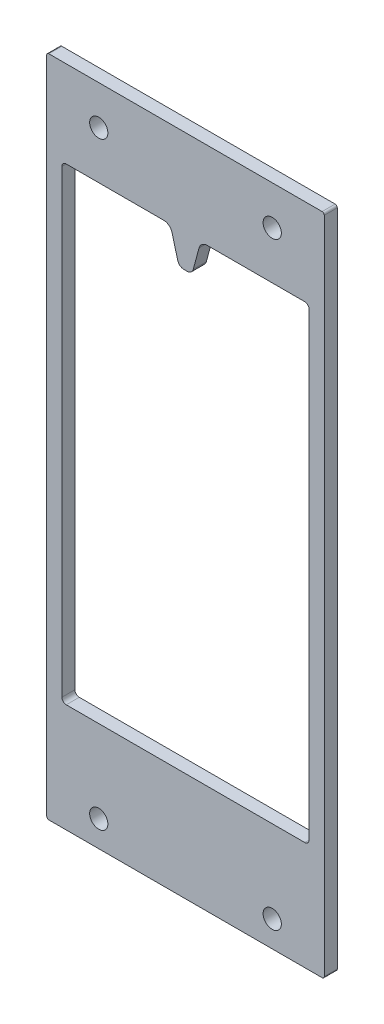
ISO-10303-21;
HEADER;
FILE_DESCRIPTION(('STEP AP214'),'2;1');
FILE_NAME('part.step','',(''),(''),'','','');
FILE_SCHEMA(('AUTOMOTIVE_DESIGN { 1 0 10303 214 1 1 1 1 }'));
ENDSEC;
DATA;
#1=APPLICATION_CONTEXT('core data for automotive mechanical design processes');
#2=APPLICATION_PROTOCOL_DEFINITION('international standard','automotive_design',2000,#1);
#3=PRODUCT_CONTEXT('',#1,'mechanical');
#4=PRODUCT('Part','Part','',(#3));
#5=PRODUCT_RELATED_PRODUCT_CATEGORY('part','',(#4));
#6=PRODUCT_DEFINITION_FORMATION('','',#4);
#7=PRODUCT_DEFINITION_CONTEXT('part definition',#1,'design');
#8=PRODUCT_DEFINITION('design','',#6,#7);
#9=PRODUCT_DEFINITION_SHAPE('','',#8);
#10=(LENGTH_UNIT() NAMED_UNIT(*) SI_UNIT(.MILLI.,.METRE.));
#11=(NAMED_UNIT(*) PLANE_ANGLE_UNIT() SI_UNIT($,.RADIAN.));
#12=(NAMED_UNIT(*) SI_UNIT($,.STERADIAN.) SOLID_ANGLE_UNIT());
#13=UNCERTAINTY_MEASURE_WITH_UNIT(LENGTH_MEASURE(1.E-05),#10,'distance_accuracy_value','');
#14=(GEOMETRIC_REPRESENTATION_CONTEXT(3) GLOBAL_UNCERTAINTY_ASSIGNED_CONTEXT((#13)) GLOBAL_UNIT_ASSIGNED_CONTEXT((#10,
#11,#12)) REPRESENTATION_CONTEXT('',''));
#15=CARTESIAN_POINT('',(0.,0.,0.));
#16=DIRECTION('',(0.,0.,1.));
#17=DIRECTION('',(1.,0.,0.));
#18=AXIS2_PLACEMENT_3D('',#15,#16,#17);
#19=CARTESIAN_POINT('',(0.,0.,3.));
#20=DIRECTION('',(0.,0.,1.));
#21=DIRECTION('',(1.,0.,0.));
#22=AXIS2_PLACEMENT_3D('',#19,#20,#21);
#23=PLANE('',#22);
#24=CARTESIAN_POINT('',(48.5,-127.,3.));
#25=DIRECTION('',(0.,0.,1.));
#26=DIRECTION('',(1.,0.,0.));
#27=AXIS2_PLACEMENT_3D('',#24,#25,#26);
#28=CIRCLE('',#27,2.09999999999999);
#29=CARTESIAN_POINT('',(50.6,-127.,3.));
#30=VERTEX_POINT('',#29);
#31=EDGE_CURVE('E516',#30,#30,#28,.T.);
#32=ORIENTED_EDGE('',*,*,#31,.F.);
#33=EDGE_LOOP('',(#32));
#34=FACE_BOUND('',#33,.T.);
#35=CARTESIAN_POINT('',(8.49999999999999,11.,3.));
#36=DIRECTION('',(0.,0.,1.));
#37=DIRECTION('',(1.,0.,0.));
#38=AXIS2_PLACEMENT_3D('',#35,#36,#37);
#39=CIRCLE('',#38,2.1);
#40=CARTESIAN_POINT('',(10.6,11.,3.));
#41=VERTEX_POINT('',#40);
#42=EDGE_CURVE('E260',#41,#41,#39,.T.);
#43=ORIENTED_EDGE('',*,*,#42,.F.);
#44=EDGE_LOOP('',(#43));
#45=FACE_BOUND('',#44,.T.);
#46=DIRECTION('',(1.,0.,0.));
#47=VECTOR('',#46,1.);
#48=CARTESIAN_POINT('',(-3.49999999999999,-133.,3.));
#49=LINE('',#48,#47);
#50=CARTESIAN_POINT('',(-2.99999999999999,-133.,3.));
#51=VERTEX_POINT('',#50);
#52=CARTESIAN_POINT('',(60.,-133.,3.));
#53=VERTEX_POINT('',#52);
#54=EDGE_CURVE('E325',#51,#53,#49,.T.);
#55=ORIENTED_EDGE('',*,*,#54,.T.);
#56=CARTESIAN_POINT('',(60.,-132.5,3.));
#57=DIRECTION('',(0.,0.,1.));
#58=DIRECTION('',(1.,0.,0.));
#59=AXIS2_PLACEMENT_3D('',#56,#57,#58);
#60=CIRCLE('',#59,0.5);
#61=CARTESIAN_POINT('',(60.5,-132.5,3.));
#62=VERTEX_POINT('',#61);
#63=EDGE_CURVE('E387',#53,#62,#60,.T.);
#64=ORIENTED_EDGE('',*,*,#63,.T.);
#65=DIRECTION('',(0.,1.,0.));
#66=VECTOR('',#65,1.);
#67=CARTESIAN_POINT('',(60.5,20.,3.));
#68=LINE('',#67,#66);
#69=CARTESIAN_POINT('',(60.5,19.5,3.));
#70=VERTEX_POINT('',#69);
#71=EDGE_CURVE('E330',#62,#70,#68,.T.);
#72=ORIENTED_EDGE('',*,*,#71,.T.);
#73=CARTESIAN_POINT('',(60.,19.5,3.));
#74=DIRECTION('',(0.,0.,1.));
#75=DIRECTION('',(1.,0.,0.));
#76=AXIS2_PLACEMENT_3D('',#73,#74,#75);
#77=CIRCLE('',#76,0.5);
#78=CARTESIAN_POINT('',(60.,20.,3.));
#79=VERTEX_POINT('',#78);
#80=EDGE_CURVE('E381',#70,#79,#77,.T.);
#81=ORIENTED_EDGE('',*,*,#80,.T.);
#82=DIRECTION('',(-1.,0.,0.));
#83=VECTOR('',#82,1.);
#84=CARTESIAN_POINT('',(-3.50000000000001,20.,3.));
#85=LINE('',#84,#83);
#86=CARTESIAN_POINT('',(-3.00000000000001,20.,3.));
#87=VERTEX_POINT('',#86);
#88=EDGE_CURVE('E334',#79,#87,#85,.T.);
#89=ORIENTED_EDGE('',*,*,#88,.T.);
#90=CARTESIAN_POINT('',(-3.00000000000001,19.5,3.));
#91=DIRECTION('',(0.,0.,1.));
#92=DIRECTION('',(1.,0.,0.));
#93=AXIS2_PLACEMENT_3D('',#90,#91,#92);
#94=CIRCLE('',#93,0.5);
#95=CARTESIAN_POINT('',(-3.50000000000001,19.5,3.));
#96=VERTEX_POINT('',#95);
#97=EDGE_CURVE('E378',#87,#96,#94,.T.);
#98=ORIENTED_EDGE('',*,*,#97,.T.);
#99=DIRECTION('',(0.,-1.,0.));
#100=VECTOR('',#99,1.);
#101=CARTESIAN_POINT('',(-3.50000000000001,20.,3.));
#102=LINE('',#101,#100);
#103=CARTESIAN_POINT('',(-3.49999999999999,-132.5,3.));
#104=VERTEX_POINT('',#103);
#105=EDGE_CURVE('E321',#96,#104,#102,.T.);
#106=ORIENTED_EDGE('',*,*,#105,.T.);
#107=CARTESIAN_POINT('',(-2.99999999999999,-132.5,3.));
#108=DIRECTION('',(0.,0.,1.));
#109=DIRECTION('',(1.,0.,0.));
#110=AXIS2_PLACEMENT_3D('',#107,#108,#109);
#111=CIRCLE('',#110,0.5);
#112=EDGE_CURVE('E384',#104,#51,#111,.T.);
#113=ORIENTED_EDGE('',*,*,#112,.T.);
#114=EDGE_LOOP('',(#55,#64,#72,#81,#89,#98,#106,#113));
#115=FACE_BOUND('',#114,.T.);
#116=DIRECTION('',(1.,0.,0.));
#117=VECTOR('',#116,1.);
#118=CARTESIAN_POINT('',(0.,-108.,3.));
#119=LINE('',#118,#117);
#120=CARTESIAN_POINT('',(1.00000000000001,-108.,3.));
#121=VERTEX_POINT('',#120);
#122=CARTESIAN_POINT('',(56.,-108.,3.));
#123=VERTEX_POINT('',#122);
#124=EDGE_CURVE('E497',#121,#123,#119,.T.);
#125=ORIENTED_EDGE('',*,*,#124,.F.);
#126=CARTESIAN_POINT('',(1.00000000000001,-107.,3.));
#127=DIRECTION('',(0.,0.,1.));
#128=DIRECTION('',(1.,0.,0.));
#129=AXIS2_PLACEMENT_3D('',#126,#127,#128);
#130=CIRCLE('',#129,1.);
#131=CARTESIAN_POINT('',(0.,-107.,3.));
#132=VERTEX_POINT('',#131);
#133=EDGE_CURVE('E439',#121,#132,#130,.F.);
#134=ORIENTED_EDGE('',*,*,#133,.T.);
#135=DIRECTION('',(0.,-1.,0.));
#136=VECTOR('',#135,1.);
#137=CARTESIAN_POINT('',(0.,0.,3.));
#138=LINE('',#137,#136);
#139=CARTESIAN_POINT('',(0.,-1.,3.));
#140=VERTEX_POINT('',#139);
#141=EDGE_CURVE('E301',#140,#132,#138,.T.);
#142=ORIENTED_EDGE('',*,*,#141,.F.);
#143=CARTESIAN_POINT('',(1.,-1.,3.));
#144=DIRECTION('',(0.,0.,1.));
#145=DIRECTION('',(1.,0.,0.));
#146=AXIS2_PLACEMENT_3D('',#143,#144,#145);
#147=CIRCLE('',#146,1.);
#148=CARTESIAN_POINT('',(1.,0.,3.));
#149=VERTEX_POINT('',#148);
#150=EDGE_CURVE('E11',#140,#149,#147,.F.);
#151=ORIENTED_EDGE('',*,*,#150,.T.);
#152=DIRECTION('',(-1.,0.,0.));
#153=VECTOR('',#152,1.);
#154=CARTESIAN_POINT('',(0.,0.,3.));
#155=LINE('',#154,#153);
#156=CARTESIAN_POINT('',(23.4557270808087,0.,3.));
#157=VERTEX_POINT('',#156);
#158=EDGE_CURVE('E251',#157,#149,#155,.T.);
#159=ORIENTED_EDGE('',*,*,#158,.F.);
#160=CARTESIAN_POINT('',(23.4557270808087,-2.,3.));
#161=DIRECTION('',(0.,0.,1.));
#162=DIRECTION('',(1.,0.,0.));
#163=AXIS2_PLACEMENT_3D('',#160,#161,#162);
#164=CIRCLE('',#163,2.);
#165=CARTESIAN_POINT('',(25.3875787333868,-1.48236190979496,3.));
#166=VERTEX_POINT('',#165);
#167=EDGE_CURVE('E247',#166,#157,#164,.T.);
#168=ORIENTED_EDGE('',*,*,#167,.F.);
#169=DIRECTION('',(-0.258819045102519,0.965925826289069,0.));
#170=VECTOR('',#169,1.);
#171=CARTESIAN_POINT('',(25.3875787333868,-1.48236190979496,3.));
#172=LINE('',#171,#170);
#173=CARTESIAN_POINT('',(26.7021017425348,-6.38822856765378,3.));
#174=VERTEX_POINT('',#173);
#175=EDGE_CURVE('E244',#174,#166,#172,.T.);
#176=ORIENTED_EDGE('',*,*,#175,.F.);
#177=CARTESIAN_POINT('',(28.1509904819684,-6.,3.));
#178=DIRECTION('',(0.,0.,-1.));
#179=DIRECTION('',(-1.,0.,0.));
#180=AXIS2_PLACEMENT_3D('',#177,#178,#179);
#181=CIRCLE('',#180,1.5);
#182=CARTESIAN_POINT('',(28.1509904819684,-7.5,3.));
#183=VERTEX_POINT('',#182);
#184=EDGE_CURVE('E241',#183,#174,#181,.T.);
#185=ORIENTED_EDGE('',*,*,#184,.F.);
#186=DIRECTION('',(-1.,0.,0.));
#187=VECTOR('',#186,1.);
#188=CARTESIAN_POINT('',(28.1509904819684,-7.5,3.));
#189=LINE('',#188,#187);
#190=CARTESIAN_POINT('',(28.8490095180316,-7.5,3.));
#191=VERTEX_POINT('',#190);
#192=EDGE_CURVE('E238',#191,#183,#189,.T.);
#193=ORIENTED_EDGE('',*,*,#192,.F.);
#194=CARTESIAN_POINT('',(28.8490095180316,-6.,3.));
#195=DIRECTION('',(0.,0.,-1.));
#196=DIRECTION('',(1.,0.,0.));
#197=AXIS2_PLACEMENT_3D('',#194,#195,#196);
#198=CIRCLE('',#197,1.5);
#199=CARTESIAN_POINT('',(30.2978982574652,-6.38822856765378,3.));
#200=VERTEX_POINT('',#199);
#201=EDGE_CURVE('E232',#200,#191,#198,.T.);
#202=ORIENTED_EDGE('',*,*,#201,.F.);
#203=DIRECTION('',(-0.258819045102517,-0.965925826289069,0.));
#204=VECTOR('',#203,1.);
#205=CARTESIAN_POINT('',(30.2978982574652,-6.38822856765378,3.));
#206=LINE('',#205,#204);
#207=CARTESIAN_POINT('',(31.6124212666132,-1.48236190979497,3.));
#208=VERTEX_POINT('',#207);
#209=EDGE_CURVE('E228',#208,#200,#206,.T.);
#210=ORIENTED_EDGE('',*,*,#209,.F.);
#211=CARTESIAN_POINT('',(33.5442729191913,-2.,3.));
#212=DIRECTION('',(0.,0.,1.));
#213=DIRECTION('',(1.,0.,0.));
#214=AXIS2_PLACEMENT_3D('',#211,#212,#213);
#215=CIRCLE('',#214,2.);
#216=CARTESIAN_POINT('',(33.5442729191913,0.,3.));
#217=VERTEX_POINT('',#216);
#218=EDGE_CURVE('E212',#217,#208,#215,.T.);
#219=ORIENTED_EDGE('',*,*,#218,.F.);
#220=DIRECTION('',(-1.,0.,0.));
#221=VECTOR('',#220,1.);
#222=CARTESIAN_POINT('',(33.5442729191913,0.,3.));
#223=LINE('',#222,#221);
#224=CARTESIAN_POINT('',(56.,0.,3.));
#225=VERTEX_POINT('',#224);
#226=EDGE_CURVE('E201',#225,#217,#223,.T.);
#227=ORIENTED_EDGE('',*,*,#226,.F.);
#228=CARTESIAN_POINT('',(56.,-1.,3.));
#229=DIRECTION('',(0.,0.,1.));
#230=DIRECTION('',(1.,0.,0.));
#231=AXIS2_PLACEMENT_3D('',#228,#229,#230);
#232=CIRCLE('',#231,1.);
#233=CARTESIAN_POINT('',(57.,-1.,3.));
#234=VERTEX_POINT('',#233);
#235=EDGE_CURVE('E445',#225,#234,#232,.F.);
#236=ORIENTED_EDGE('',*,*,#235,.T.);
#237=DIRECTION('',(0.,1.,0.));
#238=VECTOR('',#237,1.);
#239=CARTESIAN_POINT('',(57.,0.,3.));
#240=LINE('',#239,#238);
#241=CARTESIAN_POINT('',(57.,-107.,3.));
#242=VERTEX_POINT('',#241);
#243=EDGE_CURVE('E213',#242,#234,#240,.T.);
#244=ORIENTED_EDGE('',*,*,#243,.F.);
#245=CARTESIAN_POINT('',(56.,-107.,3.));
#246=DIRECTION('',(0.,0.,1.));
#247=DIRECTION('',(1.,0.,0.));
#248=AXIS2_PLACEMENT_3D('',#245,#246,#247);
#249=CIRCLE('',#248,1.);
#250=EDGE_CURVE('E433',#242,#123,#249,.F.);
#251=ORIENTED_EDGE('',*,*,#250,.T.);
#252=EDGE_LOOP('',(#125,#134,#142,#151,#159,#168,#176,#185,#193,#202,#210,#219,#227,#236,#244,#251));
#253=FACE_BOUND('',#252,.T.);
#254=CARTESIAN_POINT('',(48.5,11.,3.));
#255=DIRECTION('',(0.,0.,1.));
#256=DIRECTION('',(-1.,0.,0.));
#257=AXIS2_PLACEMENT_3D('',#254,#255,#256);
#258=CIRCLE('',#257,2.1);
#259=CARTESIAN_POINT('',(46.4,11.,3.));
#260=VERTEX_POINT('',#259);
#261=EDGE_CURVE('E508',#260,#260,#258,.T.);
#262=ORIENTED_EDGE('',*,*,#261,.F.);
#263=EDGE_LOOP('',(#262));
#264=FACE_BOUND('',#263,.T.);
#265=CARTESIAN_POINT('',(8.49999999999999,-127.,3.));
#266=DIRECTION('',(0.,0.,1.));
#267=DIRECTION('',(-1.,0.,0.));
#268=AXIS2_PLACEMENT_3D('',#265,#266,#267);
#269=CIRCLE('',#268,2.1);
#270=CARTESIAN_POINT('',(6.4,-127.,3.));
#271=VERTEX_POINT('',#270);
#272=EDGE_CURVE('E524',#271,#271,#269,.T.);
#273=ORIENTED_EDGE('',*,*,#272,.F.);
#274=EDGE_LOOP('',(#273));
#275=FACE_BOUND('',#274,.T.);
#276=ADVANCED_FACE('F39',(#34,#45,#115,#253,#264,#275),#23,.T.);
#277=CARTESIAN_POINT('',(0.,0.,0.));
#278=DIRECTION('',(0.,0.,1.));
#279=DIRECTION('',(1.,0.,0.));
#280=AXIS2_PLACEMENT_3D('',#277,#278,#279);
#281=PLANE('',#280);
#282=DIRECTION('',(0.,1.,0.));
#283=VECTOR('',#282,1.);
#284=CARTESIAN_POINT('',(60.5,20.,0.));
#285=LINE('',#284,#283);
#286=CARTESIAN_POINT('',(60.5,-132.5,0.));
#287=VERTEX_POINT('',#286);
#288=CARTESIAN_POINT('',(60.5,19.5,0.));
#289=VERTEX_POINT('',#288);
#290=EDGE_CURVE('E346',#287,#289,#285,.T.);
#291=ORIENTED_EDGE('',*,*,#290,.F.);
#292=CARTESIAN_POINT('',(60.,-132.5,0.));
#293=DIRECTION('',(0.,0.,1.));
#294=DIRECTION('',(1.,0.,0.));
#295=AXIS2_PLACEMENT_3D('',#292,#293,#294);
#296=CIRCLE('',#295,0.5);
#297=CARTESIAN_POINT('',(60.,-133.,0.));
#298=VERTEX_POINT('',#297);
#299=EDGE_CURVE('E368',#287,#298,#296,.F.);
#300=ORIENTED_EDGE('',*,*,#299,.T.);
#301=DIRECTION('',(1.,0.,0.));
#302=VECTOR('',#301,1.);
#303=CARTESIAN_POINT('',(-3.49999999999999,-133.,0.));
#304=LINE('',#303,#302);
#305=CARTESIAN_POINT('',(-2.99999999999999,-133.,0.));
#306=VERTEX_POINT('',#305);
#307=EDGE_CURVE('E342',#306,#298,#304,.T.);
#308=ORIENTED_EDGE('',*,*,#307,.F.);
#309=CARTESIAN_POINT('',(-2.99999999999999,-132.5,0.));
#310=DIRECTION('',(0.,0.,1.));
#311=DIRECTION('',(1.,0.,0.));
#312=AXIS2_PLACEMENT_3D('',#309,#310,#311);
#313=CIRCLE('',#312,0.5);
#314=CARTESIAN_POINT('',(-3.49999999999999,-132.5,0.));
#315=VERTEX_POINT('',#314);
#316=EDGE_CURVE('E365',#306,#315,#313,.F.);
#317=ORIENTED_EDGE('',*,*,#316,.T.);
#318=DIRECTION('',(0.,-1.,0.));
#319=VECTOR('',#318,1.);
#320=CARTESIAN_POINT('',(-3.50000000000001,20.,0.));
#321=LINE('',#320,#319);
#322=CARTESIAN_POINT('',(-3.50000000000001,19.5,0.));
#323=VERTEX_POINT('',#322);
#324=EDGE_CURVE('E221',#323,#315,#321,.T.);
#325=ORIENTED_EDGE('',*,*,#324,.F.);
#326=CARTESIAN_POINT('',(-3.00000000000001,19.5,0.));
#327=DIRECTION('',(0.,0.,1.));
#328=DIRECTION('',(1.,0.,0.));
#329=AXIS2_PLACEMENT_3D('',#326,#327,#328);
#330=CIRCLE('',#329,0.5);
#331=CARTESIAN_POINT('',(-3.00000000000001,20.,0.));
#332=VERTEX_POINT('',#331);
#333=EDGE_CURVE('E359',#323,#332,#330,.F.);
#334=ORIENTED_EDGE('',*,*,#333,.T.);
#335=DIRECTION('',(-1.,0.,0.));
#336=VECTOR('',#335,1.);
#337=CARTESIAN_POINT('',(-3.50000000000001,20.,0.));
#338=LINE('',#337,#336);
#339=CARTESIAN_POINT('',(60.,20.,0.));
#340=VERTEX_POINT('',#339);
#341=EDGE_CURVE('E326',#340,#332,#338,.T.);
#342=ORIENTED_EDGE('',*,*,#341,.F.);
#343=CARTESIAN_POINT('',(60.,19.5,0.));
#344=DIRECTION('',(0.,0.,1.));
#345=DIRECTION('',(1.,0.,0.));
#346=AXIS2_PLACEMENT_3D('',#343,#344,#345);
#347=CIRCLE('',#346,0.5);
#348=EDGE_CURVE('E362',#340,#289,#347,.F.);
#349=ORIENTED_EDGE('',*,*,#348,.T.);
#350=EDGE_LOOP('',(#291,#300,#308,#317,#325,#334,#342,#349));
#351=FACE_BOUND('',#350,.T.);
#352=DIRECTION('',(-1.,0.,0.));
#353=VECTOR('',#352,1.);
#354=CARTESIAN_POINT('',(0.,0.,0.));
#355=LINE('',#354,#353);
#356=CARTESIAN_POINT('',(23.4557270808087,0.,0.));
#357=VERTEX_POINT('',#356);
#358=CARTESIAN_POINT('',(1.,0.,0.));
#359=VERTEX_POINT('',#358);
#360=EDGE_CURVE('E297',#357,#359,#355,.T.);
#361=ORIENTED_EDGE('',*,*,#360,.T.);
#362=CARTESIAN_POINT('',(1.,-1.,0.));
#363=DIRECTION('',(0.,0.,1.));
#364=DIRECTION('',(1.,0.,0.));
#365=AXIS2_PLACEMENT_3D('',#362,#363,#364);
#366=CIRCLE('',#365,1.);
#367=CARTESIAN_POINT('',(0.,-1.,0.));
#368=VERTEX_POINT('',#367);
#369=EDGE_CURVE('E48',#359,#368,#366,.T.);
#370=ORIENTED_EDGE('',*,*,#369,.T.);
#371=DIRECTION('',(0.,-1.,0.));
#372=VECTOR('',#371,1.);
#373=CARTESIAN_POINT('',(0.,0.,0.));
#374=LINE('',#373,#372);
#375=CARTESIAN_POINT('',(0.,-107.,0.));
#376=VERTEX_POINT('',#375);
#377=EDGE_CURVE('E255',#368,#376,#374,.T.);
#378=ORIENTED_EDGE('',*,*,#377,.T.);
#379=CARTESIAN_POINT('',(1.00000000000001,-107.,0.));
#380=DIRECTION('',(0.,0.,1.));
#381=DIRECTION('',(1.,0.,0.));
#382=AXIS2_PLACEMENT_3D('',#379,#380,#381);
#383=CIRCLE('',#382,1.);
#384=CARTESIAN_POINT('',(1.00000000000001,-108.,0.));
#385=VERTEX_POINT('',#384);
#386=EDGE_CURVE('E436',#376,#385,#383,.T.);
#387=ORIENTED_EDGE('',*,*,#386,.T.);
#388=DIRECTION('',(1.,0.,0.));
#389=VECTOR('',#388,1.);
#390=CARTESIAN_POINT('',(0.,-108.,0.));
#391=LINE('',#390,#389);
#392=CARTESIAN_POINT('',(56.,-108.,0.));
#393=VERTEX_POINT('',#392);
#394=EDGE_CURVE('E259',#385,#393,#391,.T.);
#395=ORIENTED_EDGE('',*,*,#394,.T.);
#396=CARTESIAN_POINT('',(56.,-107.,0.));
#397=DIRECTION('',(0.,0.,1.));
#398=DIRECTION('',(1.,0.,0.));
#399=AXIS2_PLACEMENT_3D('',#396,#397,#398);
#400=CIRCLE('',#399,1.);
#401=CARTESIAN_POINT('',(57.,-107.,0.));
#402=VERTEX_POINT('',#401);
#403=EDGE_CURVE('E430',#393,#402,#400,.T.);
#404=ORIENTED_EDGE('',*,*,#403,.T.);
#405=DIRECTION('',(0.,1.,0.));
#406=VECTOR('',#405,1.);
#407=CARTESIAN_POINT('',(57.,0.,0.));
#408=LINE('',#407,#406);
#409=CARTESIAN_POINT('',(57.,-1.,0.));
#410=VERTEX_POINT('',#409);
#411=EDGE_CURVE('E264',#402,#410,#408,.T.);
#412=ORIENTED_EDGE('',*,*,#411,.T.);
#413=CARTESIAN_POINT('',(56.,-1.,0.));
#414=DIRECTION('',(0.,0.,1.));
#415=DIRECTION('',(1.,0.,0.));
#416=AXIS2_PLACEMENT_3D('',#413,#414,#415);
#417=CIRCLE('',#416,1.);
#418=CARTESIAN_POINT('',(56.,0.,0.));
#419=VERTEX_POINT('',#418);
#420=EDGE_CURVE('E442',#410,#419,#417,.T.);
#421=ORIENTED_EDGE('',*,*,#420,.T.);
#422=DIRECTION('',(-1.,0.,0.));
#423=VECTOR('',#422,1.);
#424=CARTESIAN_POINT('',(33.5442729191913,0.,0.));
#425=LINE('',#424,#423);
#426=CARTESIAN_POINT('',(33.5442729191913,0.,0.));
#427=VERTEX_POINT('',#426);
#428=EDGE_CURVE('E268',#419,#427,#425,.T.);
#429=ORIENTED_EDGE('',*,*,#428,.T.);
#430=CARTESIAN_POINT('',(33.5442729191913,-2.,0.));
#431=DIRECTION('',(0.,0.,1.));
#432=DIRECTION('',(1.,0.,0.));
#433=AXIS2_PLACEMENT_3D('',#430,#431,#432);
#434=CIRCLE('',#433,2.);
#435=CARTESIAN_POINT('',(31.6124212666132,-1.48236190979497,0.));
#436=VERTEX_POINT('',#435);
#437=EDGE_CURVE('E219',#427,#436,#434,.T.);
#438=ORIENTED_EDGE('',*,*,#437,.T.);
#439=DIRECTION('',(-0.258819045102517,-0.965925826289069,0.));
#440=VECTOR('',#439,1.);
#441=CARTESIAN_POINT('',(30.2978982574652,-6.38822856765378,0.));
#442=LINE('',#441,#440);
#443=CARTESIAN_POINT('',(30.2978982574652,-6.38822856765378,0.));
#444=VERTEX_POINT('',#443);
#445=EDGE_CURVE('E273',#436,#444,#442,.T.);
#446=ORIENTED_EDGE('',*,*,#445,.T.);
#447=CARTESIAN_POINT('',(28.8490095180316,-6.,0.));
#448=DIRECTION('',(0.,0.,-1.));
#449=DIRECTION('',(1.,0.,0.));
#450=AXIS2_PLACEMENT_3D('',#447,#448,#449);
#451=CIRCLE('',#450,1.5);
#452=CARTESIAN_POINT('',(28.8490095180316,-7.5,0.));
#453=VERTEX_POINT('',#452);
#454=EDGE_CURVE('E277',#444,#453,#451,.T.);
#455=ORIENTED_EDGE('',*,*,#454,.T.);
#456=DIRECTION('',(-1.,0.,0.));
#457=VECTOR('',#456,1.);
#458=CARTESIAN_POINT('',(28.1509904819684,-7.5,0.));
#459=LINE('',#458,#457);
#460=CARTESIAN_POINT('',(28.1509904819684,-7.5,0.));
#461=VERTEX_POINT('',#460);
#462=EDGE_CURVE('E281',#453,#461,#459,.T.);
#463=ORIENTED_EDGE('',*,*,#462,.T.);
#464=CARTESIAN_POINT('',(28.1509904819684,-6.,0.));
#465=DIRECTION('',(0.,0.,-1.));
#466=DIRECTION('',(-1.,0.,0.));
#467=AXIS2_PLACEMENT_3D('',#464,#465,#466);
#468=CIRCLE('',#467,1.5);
#469=CARTESIAN_POINT('',(26.7021017425348,-6.38822856765378,0.));
#470=VERTEX_POINT('',#469);
#471=EDGE_CURVE('E285',#461,#470,#468,.T.);
#472=ORIENTED_EDGE('',*,*,#471,.T.);
#473=DIRECTION('',(-0.258819045102519,0.965925826289069,0.));
#474=VECTOR('',#473,1.);
#475=CARTESIAN_POINT('',(25.3875787333868,-1.48236190979496,0.));
#476=LINE('',#475,#474);
#477=CARTESIAN_POINT('',(25.3875787333868,-1.48236190979496,0.));
#478=VERTEX_POINT('',#477);
#479=EDGE_CURVE('E289',#470,#478,#476,.T.);
#480=ORIENTED_EDGE('',*,*,#479,.T.);
#481=CARTESIAN_POINT('',(23.4557270808087,-2.,0.));
#482=DIRECTION('',(0.,0.,1.));
#483=DIRECTION('',(1.,0.,0.));
#484=AXIS2_PLACEMENT_3D('',#481,#482,#483);
#485=CIRCLE('',#484,2.);
#486=EDGE_CURVE('E293',#478,#357,#485,.T.);
#487=ORIENTED_EDGE('',*,*,#486,.T.);
#488=EDGE_LOOP('',(#361,#370,#378,#387,#395,#404,#412,#421,#429,#438,#446,#455,#463,#472,#480,#487));
#489=FACE_BOUND('',#488,.T.);
#490=CARTESIAN_POINT('',(8.49999999999999,11.,0.));
#491=DIRECTION('',(0.,0.,1.));
#492=DIRECTION('',(1.,0.,0.));
#493=AXIS2_PLACEMENT_3D('',#490,#491,#492);
#494=CIRCLE('',#493,2.1);
#495=CARTESIAN_POINT('',(10.6,11.,0.));
#496=VERTEX_POINT('',#495);
#497=EDGE_CURVE('E504',#496,#496,#494,.T.);
#498=ORIENTED_EDGE('',*,*,#497,.T.);
#499=EDGE_LOOP('',(#498));
#500=FACE_BOUND('',#499,.T.);
#501=CARTESIAN_POINT('',(48.5,11.,0.));
#502=DIRECTION('',(0.,0.,1.));
#503=DIRECTION('',(-1.,0.,0.));
#504=AXIS2_PLACEMENT_3D('',#501,#502,#503);
#505=CIRCLE('',#504,2.1);
#506=CARTESIAN_POINT('',(46.4,11.,0.));
#507=VERTEX_POINT('',#506);
#508=EDGE_CURVE('E512',#507,#507,#505,.T.);
#509=ORIENTED_EDGE('',*,*,#508,.T.);
#510=EDGE_LOOP('',(#509));
#511=FACE_BOUND('',#510,.T.);
#512=CARTESIAN_POINT('',(48.5,-127.,0.));
#513=DIRECTION('',(0.,0.,1.));
#514=DIRECTION('',(1.,0.,0.));
#515=AXIS2_PLACEMENT_3D('',#512,#513,#514);
#516=CIRCLE('',#515,2.09999999999999);
#517=CARTESIAN_POINT('',(50.6,-127.,0.));
#518=VERTEX_POINT('',#517);
#519=EDGE_CURVE('E520',#518,#518,#516,.T.);
#520=ORIENTED_EDGE('',*,*,#519,.T.);
#521=EDGE_LOOP('',(#520));
#522=FACE_BOUND('',#521,.T.);
#523=CARTESIAN_POINT('',(8.49999999999999,-127.,0.));
#524=DIRECTION('',(0.,0.,1.));
#525=DIRECTION('',(-1.,0.,0.));
#526=AXIS2_PLACEMENT_3D('',#523,#524,#525);
#527=CIRCLE('',#526,2.1);
#528=CARTESIAN_POINT('',(6.4,-127.,0.));
#529=VERTEX_POINT('',#528);
#530=EDGE_CURVE('E528',#529,#529,#527,.T.);
#531=ORIENTED_EDGE('',*,*,#530,.T.);
#532=EDGE_LOOP('',(#531));
#533=FACE_BOUND('',#532,.T.);
#534=ADVANCED_FACE('F450',(#351,#489,#500,#511,#522,#533),#281,.F.);
#535=CARTESIAN_POINT('',(-3.50000000000001,20.,3.));
#536=DIRECTION('',(1.,0.,0.));
#537=DIRECTION('',(0.,1.,0.));
#538=AXIS2_PLACEMENT_3D('',#535,#536,#537);
#539=PLANE('',#538);
#540=ORIENTED_EDGE('',*,*,#324,.T.);
#541=DIRECTION('',(0.,0.,-1.));
#542=VECTOR('',#541,1.);
#543=CARTESIAN_POINT('',(-3.49999999999999,-132.5,3.));
#544=LINE('',#543,#542);
#545=EDGE_CURVE('E394',#315,#104,#544,.F.);
#546=ORIENTED_EDGE('',*,*,#545,.T.);
#547=ORIENTED_EDGE('',*,*,#105,.F.);
#548=DIRECTION('',(0.,0.,-1.));
#549=VECTOR('',#548,1.);
#550=CARTESIAN_POINT('',(-3.50000000000001,19.5,3.));
#551=LINE('',#550,#549);
#552=EDGE_CURVE('E390',#96,#323,#551,.T.);
#553=ORIENTED_EDGE('',*,*,#552,.T.);
#554=EDGE_LOOP('',(#540,#546,#547,#553));
#555=FACE_BOUND('',#554,.T.);
#556=ADVANCED_FACE('F545',(#555),#539,.F.);
#557=CARTESIAN_POINT('',(-3.49999999999999,-133.,3.));
#558=DIRECTION('',(0.,1.,0.));
#559=DIRECTION('',(0.,0.,1.));
#560=AXIS2_PLACEMENT_3D('',#557,#558,#559);
#561=PLANE('',#560);
#562=ORIENTED_EDGE('',*,*,#307,.T.);
#563=DIRECTION('',(0.,0.,-1.));
#564=VECTOR('',#563,1.);
#565=CARTESIAN_POINT('',(60.,-133.,3.));
#566=LINE('',#565,#564);
#567=EDGE_CURVE('E375',#298,#53,#566,.F.);
#568=ORIENTED_EDGE('',*,*,#567,.T.);
#569=ORIENTED_EDGE('',*,*,#54,.F.);
#570=DIRECTION('',(0.,0.,-1.));
#571=VECTOR('',#570,1.);
#572=CARTESIAN_POINT('',(-2.99999999999999,-133.,3.));
#573=LINE('',#572,#571);
#574=EDGE_CURVE('E371',#51,#306,#573,.T.);
#575=ORIENTED_EDGE('',*,*,#574,.T.);
#576=EDGE_LOOP('',(#562,#568,#569,#575));
#577=FACE_BOUND('',#576,.T.);
#578=ADVANCED_FACE('F560',(#577),#561,.F.);
#579=CARTESIAN_POINT('',(60.5,20.,3.));
#580=DIRECTION('',(-1.,0.,0.));
#581=DIRECTION('',(0.,-1.,0.));
#582=AXIS2_PLACEMENT_3D('',#579,#580,#581);
#583=PLANE('',#582);
#584=ORIENTED_EDGE('',*,*,#71,.F.);
#585=DIRECTION('',(0.,0.,-1.));
#586=VECTOR('',#585,1.);
#587=CARTESIAN_POINT('',(60.5,-132.5,3.));
#588=LINE('',#587,#586);
#589=EDGE_CURVE('E355',#62,#287,#588,.T.);
#590=ORIENTED_EDGE('',*,*,#589,.T.);
#591=ORIENTED_EDGE('',*,*,#290,.T.);
#592=DIRECTION('',(0.,0.,-1.));
#593=VECTOR('',#592,1.);
#594=CARTESIAN_POINT('',(60.5,19.5,3.));
#595=LINE('',#594,#593);
#596=EDGE_CURVE('E338',#289,#70,#595,.F.);
#597=ORIENTED_EDGE('',*,*,#596,.T.);
#598=EDGE_LOOP('',(#584,#590,#591,#597));
#599=FACE_BOUND('',#598,.T.);
#600=ADVANCED_FACE('F556',(#599),#583,.F.);
#601=CARTESIAN_POINT('',(-3.50000000000001,20.,3.));
#602=DIRECTION('',(0.,-1.,0.));
#603=DIRECTION('',(1.,0.,0.));
#604=AXIS2_PLACEMENT_3D('',#601,#602,#603);
#605=PLANE('',#604);
#606=ORIENTED_EDGE('',*,*,#88,.F.);
#607=DIRECTION('',(0.,0.,-1.));
#608=VECTOR('',#607,1.);
#609=CARTESIAN_POINT('',(60.,20.,3.));
#610=LINE('',#609,#608);
#611=EDGE_CURVE('E400',#79,#340,#610,.T.);
#612=ORIENTED_EDGE('',*,*,#611,.T.);
#613=ORIENTED_EDGE('',*,*,#341,.T.);
#614=DIRECTION('',(0.,0.,-1.));
#615=VECTOR('',#614,1.);
#616=CARTESIAN_POINT('',(-3.00000000000001,20.,3.));
#617=LINE('',#616,#615);
#618=EDGE_CURVE('E397',#332,#87,#617,.F.);
#619=ORIENTED_EDGE('',*,*,#618,.T.);
#620=EDGE_LOOP('',(#606,#612,#613,#619));
#621=FACE_BOUND('',#620,.T.);
#622=ADVANCED_FACE('F553',(#621),#605,.F.);
#623=CARTESIAN_POINT('',(0.,0.,3.));
#624=DIRECTION('',(1.,0.,0.));
#625=DIRECTION('',(0.,1.,0.));
#626=AXIS2_PLACEMENT_3D('',#623,#624,#625);
#627=PLANE('',#626);
#628=ORIENTED_EDGE('',*,*,#141,.T.);
#629=DIRECTION('',(0.,0.,-1.));
#630=VECTOR('',#629,1.);
#631=CARTESIAN_POINT('',(0.,-107.,0.));
#632=LINE('',#631,#630);
#633=EDGE_CURVE('E421',#132,#376,#632,.T.);
#634=ORIENTED_EDGE('',*,*,#633,.T.);
#635=ORIENTED_EDGE('',*,*,#377,.F.);
#636=DIRECTION('',(0.,0.,-1.));
#637=VECTOR('',#636,1.);
#638=CARTESIAN_POINT('',(0.,-1.,3.));
#639=LINE('',#638,#637);
#640=EDGE_CURVE('E418',#368,#140,#639,.F.);
#641=ORIENTED_EDGE('',*,*,#640,.T.);
#642=EDGE_LOOP('',(#628,#634,#635,#641));
#643=FACE_BOUND('',#642,.T.);
#644=ADVANCED_FACE('F455',(#643),#627,.T.);
#645=CARTESIAN_POINT('',(0.,-108.,3.));
#646=DIRECTION('',(0.,1.,0.));
#647=DIRECTION('',(0.,0.,1.));
#648=AXIS2_PLACEMENT_3D('',#645,#646,#647);
#649=PLANE('',#648);
#650=ORIENTED_EDGE('',*,*,#124,.T.);
#651=DIRECTION('',(0.,0.,-1.));
#652=VECTOR('',#651,1.);
#653=CARTESIAN_POINT('',(56.,-108.,0.));
#654=LINE('',#653,#652);
#655=EDGE_CURVE('E407',#123,#393,#654,.T.);
#656=ORIENTED_EDGE('',*,*,#655,.T.);
#657=ORIENTED_EDGE('',*,*,#394,.F.);
#658=DIRECTION('',(0.,0.,-1.));
#659=VECTOR('',#658,1.);
#660=CARTESIAN_POINT('',(1.00000000000001,-108.,3.));
#661=LINE('',#660,#659);
#662=EDGE_CURVE('E404',#385,#121,#661,.F.);
#663=ORIENTED_EDGE('',*,*,#662,.T.);
#664=EDGE_LOOP('',(#650,#656,#657,#663));
#665=FACE_BOUND('',#664,.T.);
#666=ADVANCED_FACE('F646',(#665),#649,.T.);
#667=CARTESIAN_POINT('',(57.,0.,3.));
#668=DIRECTION('',(-1.,0.,0.));
#669=DIRECTION('',(0.,-1.,0.));
#670=AXIS2_PLACEMENT_3D('',#667,#668,#669);
#671=PLANE('',#670);
#672=ORIENTED_EDGE('',*,*,#411,.F.);
#673=DIRECTION('',(0.,0.,-1.));
#674=VECTOR('',#673,1.);
#675=CARTESIAN_POINT('',(57.,-107.,3.));
#676=LINE('',#675,#674);
#677=EDGE_CURVE('E415',#402,#242,#676,.F.);
#678=ORIENTED_EDGE('',*,*,#677,.T.);
#679=ORIENTED_EDGE('',*,*,#243,.T.);
#680=DIRECTION('',(0.,0.,-1.));
#681=VECTOR('',#680,1.);
#682=CARTESIAN_POINT('',(57.,-1.,0.));
#683=LINE('',#682,#681);
#684=EDGE_CURVE('E411',#234,#410,#683,.T.);
#685=ORIENTED_EDGE('',*,*,#684,.T.);
#686=EDGE_LOOP('',(#672,#678,#679,#685));
#687=FACE_BOUND('',#686,.T.);
#688=ADVANCED_FACE('F494',(#687),#671,.T.);
#689=CARTESIAN_POINT('',(33.5442729191913,0.,3.));
#690=DIRECTION('',(0.,-1.,0.));
#691=DIRECTION('',(0.,0.,-1.));
#692=AXIS2_PLACEMENT_3D('',#689,#690,#691);
#693=PLANE('',#692);
#694=ORIENTED_EDGE('',*,*,#428,.F.);
#695=DIRECTION('',(0.,0.,-1.));
#696=VECTOR('',#695,1.);
#697=CARTESIAN_POINT('',(56.,0.,3.));
#698=LINE('',#697,#696);
#699=EDGE_CURVE('E208',#419,#225,#698,.F.);
#700=ORIENTED_EDGE('',*,*,#699,.T.);
#701=ORIENTED_EDGE('',*,*,#226,.T.);
#702=DIRECTION('',(0.,0.,-1.));
#703=VECTOR('',#702,1.);
#704=CARTESIAN_POINT('',(33.5442729191913,0.,3.));
#705=LINE('',#704,#703);
#706=EDGE_CURVE('E205',#217,#427,#705,.T.);
#707=ORIENTED_EDGE('',*,*,#706,.T.);
#708=EDGE_LOOP('',(#694,#700,#701,#707));
#709=FACE_BOUND('',#708,.T.);
#710=ADVANCED_FACE('F204',(#709),#693,.T.);
#711=CARTESIAN_POINT('',(33.5442729191913,-2.,3.));
#712=DIRECTION('',(0.,0.,-1.));
#713=DIRECTION('',(-1.,0.,0.));
#714=AXIS2_PLACEMENT_3D('',#711,#712,#713);
#715=CYLINDRICAL_SURFACE('',#714,2.);
#716=ORIENTED_EDGE('',*,*,#437,.F.);
#717=ORIENTED_EDGE('',*,*,#706,.F.);
#718=ORIENTED_EDGE('',*,*,#218,.T.);
#719=DIRECTION('',(0.,0.,-1.));
#720=VECTOR('',#719,1.);
#721=CARTESIAN_POINT('',(31.6124212666132,-1.48236190979497,3.));
#722=LINE('',#721,#720);
#723=EDGE_CURVE('E222',#208,#436,#722,.T.);
#724=ORIENTED_EDGE('',*,*,#723,.T.);
#725=EDGE_LOOP('',(#716,#717,#718,#724));
#726=FACE_BOUND('',#725,.T.);
#727=ADVANCED_FACE('F216',(#726),#715,.F.);
#728=CARTESIAN_POINT('',(30.2978982574652,-6.38822856765378,3.));
#729=DIRECTION('',(0.965925826289069,-0.258819045102517,0.));
#730=DIRECTION('',(0.258819045102517,0.965925826289069,0.));
#731=AXIS2_PLACEMENT_3D('',#728,#729,#730);
#732=PLANE('',#731);
#733=ORIENTED_EDGE('',*,*,#445,.F.);
#734=ORIENTED_EDGE('',*,*,#723,.F.);
#735=ORIENTED_EDGE('',*,*,#209,.T.);
#736=DIRECTION('',(0.,0.,-1.));
#737=VECTOR('',#736,1.);
#738=CARTESIAN_POINT('',(30.2978982574652,-6.38822856765378,3.));
#739=LINE('',#738,#737);
#740=EDGE_CURVE('E316',#200,#444,#739,.T.);
#741=ORIENTED_EDGE('',*,*,#740,.T.);
#742=EDGE_LOOP('',(#733,#734,#735,#741));
#743=FACE_BOUND('',#742,.T.);
#744=ADVANCED_FACE('F485',(#743),#732,.T.);
#745=CARTESIAN_POINT('',(28.8490095180316,-6.,3.));
#746=DIRECTION('',(0.,0.,-1.));
#747=DIRECTION('',(-1.,0.,0.));
#748=AXIS2_PLACEMENT_3D('',#745,#746,#747);
#749=CYLINDRICAL_SURFACE('',#748,1.5);
#750=ORIENTED_EDGE('',*,*,#454,.F.);
#751=ORIENTED_EDGE('',*,*,#740,.F.);
#752=ORIENTED_EDGE('',*,*,#201,.T.);
#753=DIRECTION('',(0.,0.,-1.));
#754=VECTOR('',#753,1.);
#755=CARTESIAN_POINT('',(28.8490095180316,-7.5,3.));
#756=LINE('',#755,#754);
#757=EDGE_CURVE('E313',#191,#453,#756,.T.);
#758=ORIENTED_EDGE('',*,*,#757,.T.);
#759=EDGE_LOOP('',(#750,#751,#752,#758));
#760=FACE_BOUND('',#759,.T.);
#761=ADVANCED_FACE('F481',(#760),#749,.T.);
#762=CARTESIAN_POINT('',(28.1509904819684,-7.5,3.));
#763=DIRECTION('',(0.,-1.,0.));
#764=DIRECTION('',(1.,0.,0.));
#765=AXIS2_PLACEMENT_3D('',#762,#763,#764);
#766=PLANE('',#765);
#767=ORIENTED_EDGE('',*,*,#462,.F.);
#768=ORIENTED_EDGE('',*,*,#757,.F.);
#769=ORIENTED_EDGE('',*,*,#192,.T.);
#770=DIRECTION('',(0.,0.,-1.));
#771=VECTOR('',#770,1.);
#772=CARTESIAN_POINT('',(28.1509904819684,-7.5,3.));
#773=LINE('',#772,#771);
#774=EDGE_CURVE('E310',#183,#461,#773,.T.);
#775=ORIENTED_EDGE('',*,*,#774,.T.);
#776=EDGE_LOOP('',(#767,#768,#769,#775));
#777=FACE_BOUND('',#776,.T.);
#778=ADVANCED_FACE('F478',(#777),#766,.T.);
#779=CARTESIAN_POINT('',(28.1509904819684,-6.,3.));
#780=DIRECTION('',(0.,0.,-1.));
#781=DIRECTION('',(-1.,0.,0.));
#782=AXIS2_PLACEMENT_3D('',#779,#780,#781);
#783=CYLINDRICAL_SURFACE('',#782,1.5);
#784=ORIENTED_EDGE('',*,*,#471,.F.);
#785=ORIENTED_EDGE('',*,*,#774,.F.);
#786=ORIENTED_EDGE('',*,*,#184,.T.);
#787=DIRECTION('',(0.,0.,-1.));
#788=VECTOR('',#787,1.);
#789=CARTESIAN_POINT('',(26.7021017425348,-6.38822856765378,3.));
#790=LINE('',#789,#788);
#791=EDGE_CURVE('E307',#174,#470,#790,.T.);
#792=ORIENTED_EDGE('',*,*,#791,.T.);
#793=EDGE_LOOP('',(#784,#785,#786,#792));
#794=FACE_BOUND('',#793,.T.);
#795=ADVANCED_FACE('F472',(#794),#783,.T.);
#796=CARTESIAN_POINT('',(25.3875787333868,-1.48236190979496,3.));
#797=DIRECTION('',(-0.965925826289069,-0.258819045102519,0.));
#798=DIRECTION('',(0.258819045102519,-0.965925826289069,0.));
#799=AXIS2_PLACEMENT_3D('',#796,#797,#798);
#800=PLANE('',#799);
#801=ORIENTED_EDGE('',*,*,#479,.F.);
#802=ORIENTED_EDGE('',*,*,#791,.F.);
#803=ORIENTED_EDGE('',*,*,#175,.T.);
#804=DIRECTION('',(0.,0.,-1.));
#805=VECTOR('',#804,1.);
#806=CARTESIAN_POINT('',(25.3875787333868,-1.48236190979496,3.));
#807=LINE('',#806,#805);
#808=EDGE_CURVE('E304',#166,#478,#807,.T.);
#809=ORIENTED_EDGE('',*,*,#808,.T.);
#810=EDGE_LOOP('',(#801,#802,#803,#809));
#811=FACE_BOUND('',#810,.T.);
#812=ADVANCED_FACE('F468',(#811),#800,.T.);
#813=CARTESIAN_POINT('',(23.4557270808087,-2.,3.));
#814=DIRECTION('',(0.,0.,-1.));
#815=DIRECTION('',(-1.,0.,0.));
#816=AXIS2_PLACEMENT_3D('',#813,#814,#815);
#817=CYLINDRICAL_SURFACE('',#816,2.);
#818=ORIENTED_EDGE('',*,*,#486,.F.);
#819=ORIENTED_EDGE('',*,*,#808,.F.);
#820=ORIENTED_EDGE('',*,*,#167,.T.);
#821=DIRECTION('',(0.,0.,-1.));
#822=VECTOR('',#821,1.);
#823=CARTESIAN_POINT('',(23.4557270808087,0.,3.));
#824=LINE('',#823,#822);
#825=EDGE_CURVE('E254',#157,#357,#824,.T.);
#826=ORIENTED_EDGE('',*,*,#825,.T.);
#827=EDGE_LOOP('',(#818,#819,#820,#826));
#828=FACE_BOUND('',#827,.T.);
#829=ADVANCED_FACE('F465',(#828),#817,.F.);
#830=CARTESIAN_POINT('',(0.,0.,3.));
#831=DIRECTION('',(0.,-1.,0.));
#832=DIRECTION('',(0.,0.,-1.));
#833=AXIS2_PLACEMENT_3D('',#830,#831,#832);
#834=PLANE('',#833);
#835=ORIENTED_EDGE('',*,*,#158,.T.);
#836=DIRECTION('',(0.,0.,-1.));
#837=VECTOR('',#836,1.);
#838=CARTESIAN_POINT('',(1.,0.,0.));
#839=LINE('',#838,#837);
#840=EDGE_CURVE('E427',#149,#359,#839,.T.);
#841=ORIENTED_EDGE('',*,*,#840,.T.);
#842=ORIENTED_EDGE('',*,*,#360,.F.);
#843=ORIENTED_EDGE('',*,*,#825,.F.);
#844=EDGE_LOOP('',(#835,#841,#842,#843));
#845=FACE_BOUND('',#844,.T.);
#846=ADVANCED_FACE('F458',(#845),#834,.T.);
#847=CARTESIAN_POINT('',(8.49999999999999,11.,3.));
#848=DIRECTION('',(0.,0.,-1.));
#849=DIRECTION('',(-1.,0.,0.));
#850=AXIS2_PLACEMENT_3D('',#847,#848,#849);
#851=CYLINDRICAL_SURFACE('',#850,2.1);
#852=ORIENTED_EDGE('',*,*,#42,.T.);
#853=EDGE_LOOP('',(#852));
#854=FACE_BOUND('',#853,.T.);
#855=ORIENTED_EDGE('',*,*,#497,.F.);
#856=EDGE_LOOP('',(#855));
#857=FACE_BOUND('',#856,.T.);
#858=ADVANCED_FACE('F623',(#854,#857),#851,.F.);
#859=CARTESIAN_POINT('',(48.5,11.,3.));
#860=DIRECTION('',(0.,0.,-1.));
#861=DIRECTION('',(-1.,0.,0.));
#862=AXIS2_PLACEMENT_3D('',#859,#860,#861);
#863=CYLINDRICAL_SURFACE('',#862,2.1);
#864=ORIENTED_EDGE('',*,*,#261,.T.);
#865=EDGE_LOOP('',(#864));
#866=FACE_BOUND('',#865,.T.);
#867=ORIENTED_EDGE('',*,*,#508,.F.);
#868=EDGE_LOOP('',(#867));
#869=FACE_BOUND('',#868,.T.);
#870=ADVANCED_FACE('F736',(#866,#869),#863,.F.);
#871=CARTESIAN_POINT('',(48.5,-127.,3.));
#872=DIRECTION('',(0.,0.,-1.));
#873=DIRECTION('',(-1.,0.,0.));
#874=AXIS2_PLACEMENT_3D('',#871,#872,#873);
#875=CYLINDRICAL_SURFACE('',#874,2.09999999999999);
#876=ORIENTED_EDGE('',*,*,#31,.T.);
#877=EDGE_LOOP('',(#876));
#878=FACE_BOUND('',#877,.T.);
#879=ORIENTED_EDGE('',*,*,#519,.F.);
#880=EDGE_LOOP('',(#879));
#881=FACE_BOUND('',#880,.T.);
#882=ADVANCED_FACE('F727',(#878,#881),#875,.F.);
#883=CARTESIAN_POINT('',(8.49999999999999,-127.,3.));
#884=DIRECTION('',(0.,0.,-1.));
#885=DIRECTION('',(-1.,0.,0.));
#886=AXIS2_PLACEMENT_3D('',#883,#884,#885);
#887=CYLINDRICAL_SURFACE('',#886,2.1);
#888=ORIENTED_EDGE('',*,*,#272,.T.);
#889=EDGE_LOOP('',(#888));
#890=FACE_BOUND('',#889,.T.);
#891=ORIENTED_EDGE('',*,*,#530,.F.);
#892=EDGE_LOOP('',(#891));
#893=FACE_BOUND('',#892,.T.);
#894=ADVANCED_FACE('F536',(#890,#893),#887,.F.);
#895=CARTESIAN_POINT('',(60.,-132.5,3.));
#896=DIRECTION('',(0.,0.,-1.));
#897=DIRECTION('',(-1.,0.,0.));
#898=AXIS2_PLACEMENT_3D('',#895,#896,#897);
#899=CYLINDRICAL_SURFACE('',#898,0.5);
#900=ORIENTED_EDGE('',*,*,#63,.F.);
#901=ORIENTED_EDGE('',*,*,#567,.F.);
#902=ORIENTED_EDGE('',*,*,#299,.F.);
#903=ORIENTED_EDGE('',*,*,#589,.F.);
#904=EDGE_LOOP('',(#900,#901,#902,#903));
#905=FACE_BOUND('',#904,.T.);
#906=ADVANCED_FACE('F568',(#905),#899,.T.);
#907=CARTESIAN_POINT('',(-2.99999999999999,-132.5,3.));
#908=DIRECTION('',(0.,0.,-1.));
#909=DIRECTION('',(-1.,0.,0.));
#910=AXIS2_PLACEMENT_3D('',#907,#908,#909);
#911=CYLINDRICAL_SURFACE('',#910,0.5);
#912=ORIENTED_EDGE('',*,*,#112,.F.);
#913=ORIENTED_EDGE('',*,*,#545,.F.);
#914=ORIENTED_EDGE('',*,*,#316,.F.);
#915=ORIENTED_EDGE('',*,*,#574,.F.);
#916=EDGE_LOOP('',(#912,#913,#914,#915));
#917=FACE_BOUND('',#916,.T.);
#918=ADVANCED_FACE('F571',(#917),#911,.T.);
#919=CARTESIAN_POINT('',(60.,19.5,3.));
#920=DIRECTION('',(0.,0.,-1.));
#921=DIRECTION('',(-1.,0.,0.));
#922=AXIS2_PLACEMENT_3D('',#919,#920,#921);
#923=CYLINDRICAL_SURFACE('',#922,0.5);
#924=ORIENTED_EDGE('',*,*,#80,.F.);
#925=ORIENTED_EDGE('',*,*,#596,.F.);
#926=ORIENTED_EDGE('',*,*,#348,.F.);
#927=ORIENTED_EDGE('',*,*,#611,.F.);
#928=EDGE_LOOP('',(#924,#925,#926,#927));
#929=FACE_BOUND('',#928,.T.);
#930=ADVANCED_FACE('F575',(#929),#923,.T.);
#931=CARTESIAN_POINT('',(-3.00000000000001,19.5,3.));
#932=DIRECTION('',(0.,0.,-1.));
#933=DIRECTION('',(-1.,0.,0.));
#934=AXIS2_PLACEMENT_3D('',#931,#932,#933);
#935=CYLINDRICAL_SURFACE('',#934,0.5);
#936=ORIENTED_EDGE('',*,*,#97,.F.);
#937=ORIENTED_EDGE('',*,*,#618,.F.);
#938=ORIENTED_EDGE('',*,*,#333,.F.);
#939=ORIENTED_EDGE('',*,*,#552,.F.);
#940=EDGE_LOOP('',(#936,#937,#938,#939));
#941=FACE_BOUND('',#940,.T.);
#942=ADVANCED_FACE('F579',(#941),#935,.T.);
#943=CARTESIAN_POINT('',(56.,-107.,3.));
#944=DIRECTION('',(0.,0.,1.));
#945=DIRECTION('',(1.,0.,0.));
#946=AXIS2_PLACEMENT_3D('',#943,#944,#945);
#947=CYLINDRICAL_SURFACE('',#946,1.);
#948=ORIENTED_EDGE('',*,*,#250,.F.);
#949=ORIENTED_EDGE('',*,*,#677,.F.);
#950=ORIENTED_EDGE('',*,*,#403,.F.);
#951=ORIENTED_EDGE('',*,*,#655,.F.);
#952=EDGE_LOOP('',(#948,#949,#950,#951));
#953=FACE_BOUND('',#952,.T.);
#954=ADVANCED_FACE('F583',(#953),#947,.F.);
#955=CARTESIAN_POINT('',(1.00000000000001,-107.,3.));
#956=DIRECTION('',(0.,0.,1.));
#957=DIRECTION('',(1.,0.,0.));
#958=AXIS2_PLACEMENT_3D('',#955,#956,#957);
#959=CYLINDRICAL_SURFACE('',#958,1.);
#960=ORIENTED_EDGE('',*,*,#133,.F.);
#961=ORIENTED_EDGE('',*,*,#662,.F.);
#962=ORIENTED_EDGE('',*,*,#386,.F.);
#963=ORIENTED_EDGE('',*,*,#633,.F.);
#964=EDGE_LOOP('',(#960,#961,#962,#963));
#965=FACE_BOUND('',#964,.T.);
#966=ADVANCED_FACE('F587',(#965),#959,.F.);
#967=CARTESIAN_POINT('',(56.,-1.,3.));
#968=DIRECTION('',(0.,0.,1.));
#969=DIRECTION('',(1.,0.,0.));
#970=AXIS2_PLACEMENT_3D('',#967,#968,#969);
#971=CYLINDRICAL_SURFACE('',#970,1.);
#972=ORIENTED_EDGE('',*,*,#235,.F.);
#973=ORIENTED_EDGE('',*,*,#699,.F.);
#974=ORIENTED_EDGE('',*,*,#420,.F.);
#975=ORIENTED_EDGE('',*,*,#684,.F.);
#976=EDGE_LOOP('',(#972,#973,#974,#975));
#977=FACE_BOUND('',#976,.T.);
#978=ADVANCED_FACE('F487',(#977),#971,.F.);
#979=CARTESIAN_POINT('',(1.,-1.,3.));
#980=DIRECTION('',(0.,0.,1.));
#981=DIRECTION('',(1.,0.,0.));
#982=AXIS2_PLACEMENT_3D('',#979,#980,#981);
#983=CYLINDRICAL_SURFACE('',#982,1.);
#984=ORIENTED_EDGE('',*,*,#150,.F.);
#985=ORIENTED_EDGE('',*,*,#640,.F.);
#986=ORIENTED_EDGE('',*,*,#369,.F.);
#987=ORIENTED_EDGE('',*,*,#840,.F.);
#988=EDGE_LOOP('',(#984,#985,#986,#987));
#989=FACE_BOUND('',#988,.T.);
#990=ADVANCED_FACE('F41',(#989),#983,.F.);
#991=CLOSED_SHELL('',(#276,#534,#556,#578,#600,#622,#644,#666,#688,#710,#727,#744,#761,#778,
#795,#812,#829,#846,#858,#870,#882,#894,#906,#918,#930,#942,#954,#966,#978,#990));
#992=MANIFOLD_SOLID_BREP('B2',#991);
#993=ADVANCED_BREP_SHAPE_REPRESENTATION('',(#18,#992),#14);
#994=SHAPE_DEFINITION_REPRESENTATION(#9,#993);
ENDSEC;
END-ISO-10303-21;
